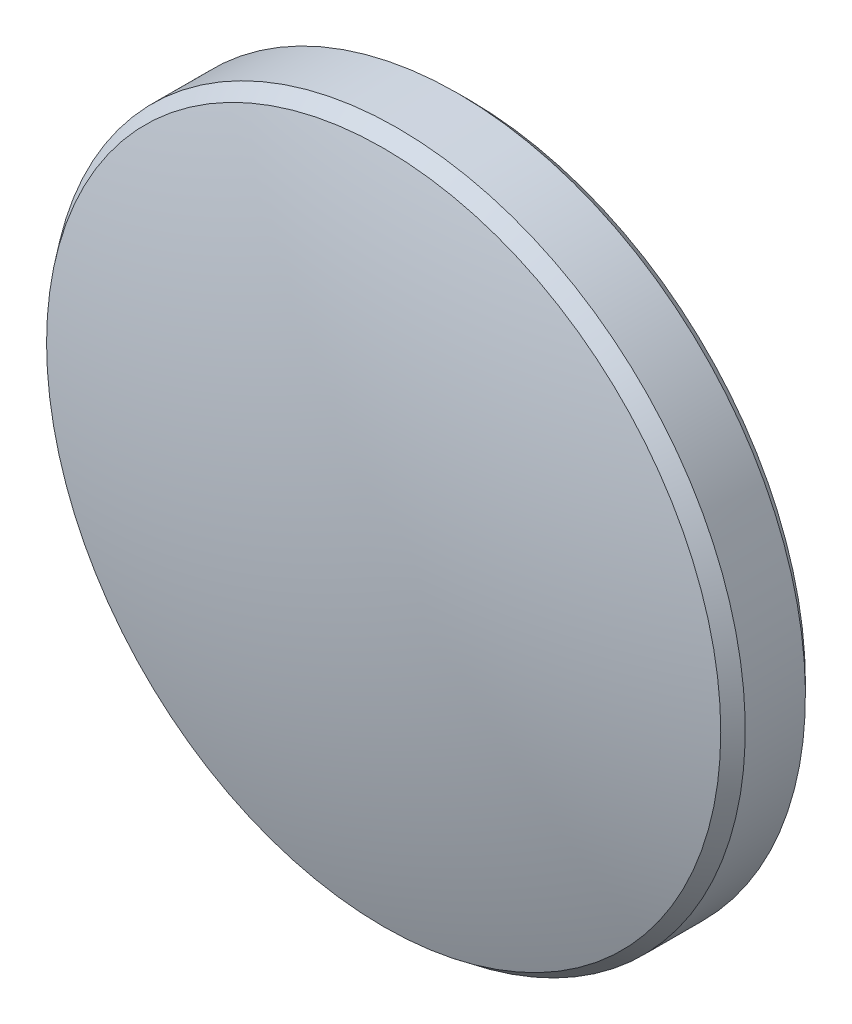
ISO-10303-21;
HEADER;
FILE_DESCRIPTION(('STEP AP214'),'2;1');
FILE_NAME('part.step','',(''),(''),'','','');
FILE_SCHEMA(('AUTOMOTIVE_DESIGN { 1 0 10303 214 1 1 1 1 }'));
ENDSEC;
DATA;
#1=APPLICATION_CONTEXT('core data for automotive mechanical design processes');
#2=APPLICATION_PROTOCOL_DEFINITION('international standard','automotive_design',2000,#1);
#3=PRODUCT_CONTEXT('',#1,'mechanical');
#4=PRODUCT('Part','Part','',(#3));
#5=PRODUCT_RELATED_PRODUCT_CATEGORY('part','',(#4));
#6=PRODUCT_DEFINITION_FORMATION('','',#4);
#7=PRODUCT_DEFINITION_CONTEXT('part definition',#1,'design');
#8=PRODUCT_DEFINITION('design','',#6,#7);
#9=PRODUCT_DEFINITION_SHAPE('','',#8);
#10=(LENGTH_UNIT() NAMED_UNIT(*) SI_UNIT(.MILLI.,.METRE.));
#11=(NAMED_UNIT(*) PLANE_ANGLE_UNIT() SI_UNIT($,.RADIAN.));
#12=(NAMED_UNIT(*) SI_UNIT($,.STERADIAN.) SOLID_ANGLE_UNIT());
#13=UNCERTAINTY_MEASURE_WITH_UNIT(LENGTH_MEASURE(1.E-05),#10,'distance_accuracy_value','');
#14=(GEOMETRIC_REPRESENTATION_CONTEXT(3) GLOBAL_UNCERTAINTY_ASSIGNED_CONTEXT((#13)) GLOBAL_UNIT_ASSIGNED_CONTEXT((#10,
#11,#12)) REPRESENTATION_CONTEXT('',''));
#15=CARTESIAN_POINT('',(0.,0.,0.));
#16=DIRECTION('',(0.,0.,1.));
#17=DIRECTION('',(1.,0.,0.));
#18=AXIS2_PLACEMENT_3D('',#15,#16,#17);
#19=CARTESIAN_POINT('',(0.,0.,-1.225));
#20=DIRECTION('',(0.,0.,-1.));
#21=DIRECTION('',(0.,1.,0.));
#22=AXIS2_PLACEMENT_3D('',#19,#20,#21);
#23=PLANE('',#22);
#24=CARTESIAN_POINT('',(0.,0.,-1.225));
#25=DIRECTION('',(0.,0.,-1.));
#26=DIRECTION('',(0.,1.,0.));
#27=AXIS2_PLACEMENT_3D('',#24,#25,#26);
#28=CIRCLE('',#27,6.15);
#29=CARTESIAN_POINT('',(0.,6.15,-1.225));
#30=VERTEX_POINT('',#29);
#31=EDGE_CURVE('E29',#30,#30,#28,.T.);
#32=ORIENTED_EDGE('',*,*,#31,.T.);
#33=EDGE_LOOP('',(#32));
#34=FACE_BOUND('',#33,.T.);
#35=ADVANCED_FACE('F14',(#34),#23,.T.);
#36=CARTESIAN_POINT('',(0.,0.,-20.4650000000002));
#37=DIRECTION('',(0.,0.,-1.));
#38=DIRECTION('',(0.,1.,0.));
#39=AXIS2_PLACEMENT_3D('',#36,#37,#38);
#40=SPHERICAL_SURFACE('',#39,21.6900000000001);
#41=CARTESIAN_POINT('',(0.,0.,0.331983435015806));
#42=DIRECTION('',(0.,0.,-1.));
#43=DIRECTION('',(0.,1.,0.));
#44=AXIS2_PLACEMENT_3D('',#41,#42,#43);
#45=CIRCLE('',#44,6.15967369295442);
#46=CARTESIAN_POINT('',(0.,6.15967369295441,0.331983435015808));
#47=VERTEX_POINT('',#46);
#48=EDGE_CURVE('E10',#47,#47,#45,.F.);
#49=ORIENTED_EDGE('',*,*,#48,.T.);
#50=EDGE_LOOP('',(#49));
#51=FACE_BOUND('',#50,.T.);
#52=ADVANCED_FACE('F46',(#51),#40,.T.);
#53=CARTESIAN_POINT('',(0.,0.,-1.225));
#54=DIRECTION('',(0.,0.,-1.));
#55=DIRECTION('',(0.,1.,0.));
#56=AXIS2_PLACEMENT_3D('',#53,#54,#55);
#57=CYLINDRICAL_SURFACE('',#56,6.35000000000001);
#58=CARTESIAN_POINT('',(0.,0.,-1.02499999999999));
#59=DIRECTION('',(0.,0.,-1.));
#60=DIRECTION('',(0.,1.,0.));
#61=AXIS2_PLACEMENT_3D('',#58,#59,#60);
#62=CIRCLE('',#61,6.35000000000001);
#63=CARTESIAN_POINT('',(0.,6.35000000000001,-1.02499999999999));
#64=VERTEX_POINT('',#63);
#65=EDGE_CURVE('E21',#64,#64,#62,.F.);
#66=ORIENTED_EDGE('',*,*,#65,.T.);
#67=EDGE_LOOP('',(#66));
#68=FACE_BOUND('',#67,.T.);
#69=CARTESIAN_POINT('',(0.,0.,0.0746624851996256));
#70=DIRECTION('',(0.,0.,1.));
#71=DIRECTION('',(0.,-1.,0.));
#72=AXIS2_PLACEMENT_3D('',#69,#70,#71);
#73=CIRCLE('',#72,6.35000000000001);
#74=CARTESIAN_POINT('',(0.,-6.35000000000001,0.0746624851996236));
#75=VERTEX_POINT('',#74);
#76=EDGE_CURVE('E25',#75,#75,#73,.F.);
#77=ORIENTED_EDGE('',*,*,#76,.T.);
#78=EDGE_LOOP('',(#77));
#79=FACE_BOUND('',#78,.T.);
#80=ADVANCED_FACE('F38',(#68,#79),#57,.T.);
#81=CARTESIAN_POINT('',(0.,0.,-1.225));
#82=DIRECTION('',(0.,0.,1.));
#83=DIRECTION('',(0.,-1.,0.));
#84=AXIS2_PLACEMENT_3D('',#81,#82,#83);
#85=CONICAL_SURFACE('',#84,6.15,0.785398163397457);
#86=ORIENTED_EDGE('',*,*,#65,.F.);
#87=EDGE_LOOP('',(#86));
#88=FACE_BOUND('',#87,.T.);
#89=ORIENTED_EDGE('',*,*,#31,.F.);
#90=EDGE_LOOP('',(#89));
#91=FACE_BOUND('',#90,.T.);
#92=ADVANCED_FACE('F36',(#88,#91),#85,.T.);
#93=CARTESIAN_POINT('',(0.,0.,0.0746624851996266));
#94=DIRECTION('',(0.,0.,-1.));
#95=DIRECTION('',(0.,1.,0.));
#96=AXIS2_PLACEMENT_3D('',#93,#94,#95);
#97=CONICAL_SURFACE('',#96,6.35000000000001,0.636841287525683);
#98=ORIENTED_EDGE('',*,*,#48,.F.);
#99=EDGE_LOOP('',(#98));
#100=FACE_BOUND('',#99,.T.);
#101=ORIENTED_EDGE('',*,*,#76,.F.);
#102=EDGE_LOOP('',(#101));
#103=FACE_BOUND('',#102,.T.);
#104=ADVANCED_FACE('F16',(#100,#103),#97,.T.);
#105=CLOSED_SHELL('',(#35,#52,#80,#92,#104));
#106=MANIFOLD_SOLID_BREP('B1',#105);
#107=ADVANCED_BREP_SHAPE_REPRESENTATION('',(#18,#106),#14);
#108=SHAPE_DEFINITION_REPRESENTATION(#9,#107);
ENDSEC;
END-ISO-10303-21;
